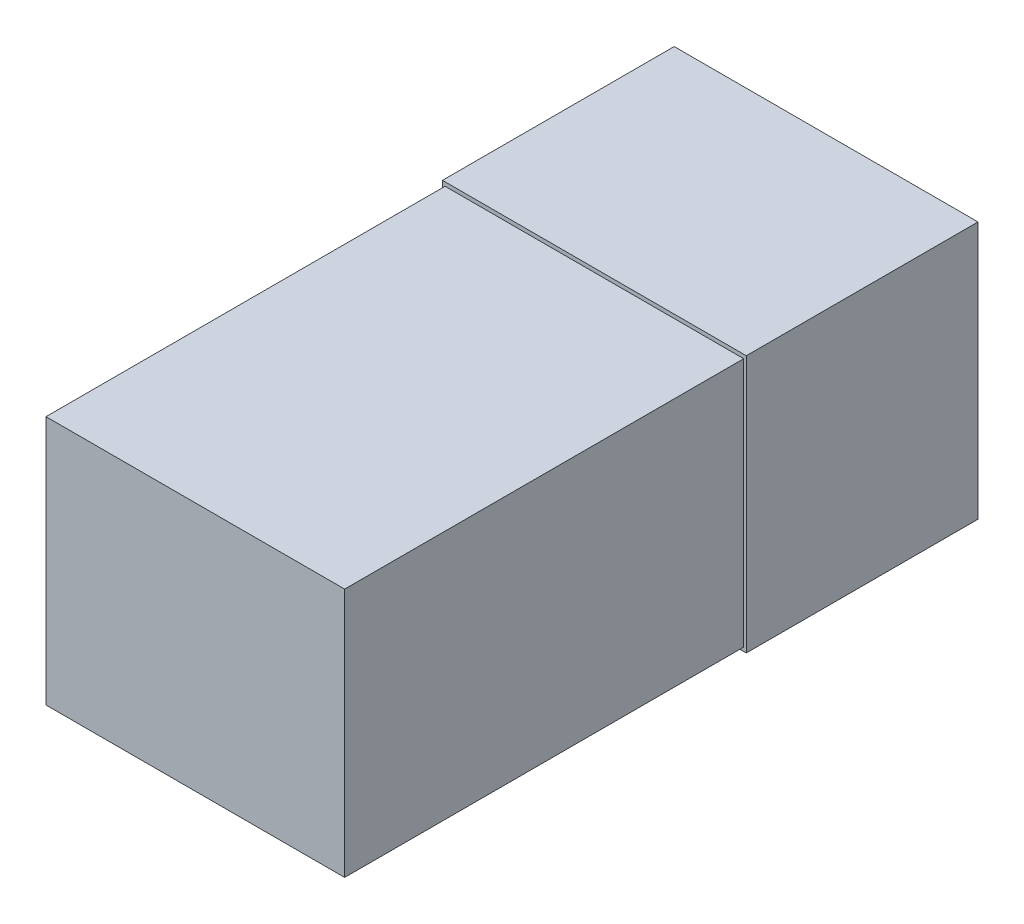
ISO-10303-21;
HEADER;
FILE_DESCRIPTION(('STEP AP214'),'2;1');
FILE_NAME('part.step','',(''),(''),'','','');
FILE_SCHEMA(('AUTOMOTIVE_DESIGN { 1 0 10303 214 1 1 1 1 }'));
ENDSEC;
DATA;
#1=APPLICATION_CONTEXT('core data for automotive mechanical design processes');
#2=APPLICATION_PROTOCOL_DEFINITION('international standard','automotive_design',2000,#1);
#3=PRODUCT_CONTEXT('',#1,'mechanical');
#4=PRODUCT('Part','Part','',(#3));
#5=PRODUCT_RELATED_PRODUCT_CATEGORY('part','',(#4));
#6=PRODUCT_DEFINITION_FORMATION('','',#4);
#7=PRODUCT_DEFINITION_CONTEXT('part definition',#1,'design');
#8=PRODUCT_DEFINITION('design','',#6,#7);
#9=PRODUCT_DEFINITION_SHAPE('','',#8);
#10=(LENGTH_UNIT() NAMED_UNIT(*) SI_UNIT(.MILLI.,.METRE.));
#11=(NAMED_UNIT(*) PLANE_ANGLE_UNIT() SI_UNIT($,.RADIAN.));
#12=(NAMED_UNIT(*) SI_UNIT($,.STERADIAN.) SOLID_ANGLE_UNIT());
#13=UNCERTAINTY_MEASURE_WITH_UNIT(LENGTH_MEASURE(1.E-05),#10,'distance_accuracy_value','');
#14=(GEOMETRIC_REPRESENTATION_CONTEXT(3) GLOBAL_UNCERTAINTY_ASSIGNED_CONTEXT((#13)) GLOBAL_UNIT_ASSIGNED_CONTEXT((#10,
#11,#12)) REPRESENTATION_CONTEXT('',''));
#15=CARTESIAN_POINT('',(0.,0.,0.));
#16=DIRECTION('',(0.,0.,1.));
#17=DIRECTION('',(1.,0.,0.));
#18=AXIS2_PLACEMENT_3D('',#15,#16,#17);
#19=CARTESIAN_POINT('',(5.8,-4.85,15.5));
#20=DIRECTION('',(-1.,0.,0.));
#21=DIRECTION('',(0.,0.,1.));
#22=AXIS2_PLACEMENT_3D('',#19,#20,#21);
#23=PLANE('',#22);
#24=DIRECTION('',(0.,1.,0.));
#25=VECTOR('',#24,1.);
#26=CARTESIAN_POINT('',(5.8,-4.85,0.));
#27=LINE('',#26,#25);
#28=CARTESIAN_POINT('',(5.8,-4.85,0.));
#29=VERTEX_POINT('',#28);
#30=CARTESIAN_POINT('',(5.8,4.85,0.));
#31=VERTEX_POINT('',#30);
#32=EDGE_CURVE('E128',#29,#31,#27,.T.);
#33=ORIENTED_EDGE('',*,*,#32,.T.);
#34=DIRECTION('',(0.,0.,-1.));
#35=VECTOR('',#34,1.);
#36=CARTESIAN_POINT('',(5.8,4.85,15.5));
#37=LINE('',#36,#35);
#38=CARTESIAN_POINT('',(5.8,4.85,15.5));
#39=VERTEX_POINT('',#38);
#40=EDGE_CURVE('E11',#39,#31,#37,.T.);
#41=ORIENTED_EDGE('',*,*,#40,.F.);
#42=DIRECTION('',(0.,1.,0.));
#43=VECTOR('',#42,1.);
#44=CARTESIAN_POINT('',(5.8,-4.85,15.5));
#45=LINE('',#44,#43);
#46=CARTESIAN_POINT('',(5.8,-4.85,15.5));
#47=VERTEX_POINT('',#46);
#48=EDGE_CURVE('E139',#47,#39,#45,.T.);
#49=ORIENTED_EDGE('',*,*,#48,.F.);
#50=DIRECTION('',(0.,0.,-1.));
#51=VECTOR('',#50,1.);
#52=CARTESIAN_POINT('',(5.8,-4.85,15.5));
#53=LINE('',#52,#51);
#54=EDGE_CURVE('E150',#47,#29,#53,.T.);
#55=ORIENTED_EDGE('',*,*,#54,.T.);
#56=EDGE_LOOP('',(#33,#41,#49,#55));
#57=FACE_BOUND('',#56,.T.);
#58=ADVANCED_FACE('F39',(#57),#23,.F.);
#59=CARTESIAN_POINT('',(-5.8,4.85,15.5));
#60=DIRECTION('',(0.,-1.,0.));
#61=DIRECTION('',(0.,0.,-1.));
#62=AXIS2_PLACEMENT_3D('',#59,#60,#61);
#63=PLANE('',#62);
#64=DIRECTION('',(-1.,0.,0.));
#65=VECTOR('',#64,1.);
#66=CARTESIAN_POINT('',(-5.8,4.85,0.));
#67=LINE('',#66,#65);
#68=CARTESIAN_POINT('',(-5.8,4.85,0.));
#69=VERTEX_POINT('',#68);
#70=EDGE_CURVE('E133',#31,#69,#67,.T.);
#71=ORIENTED_EDGE('',*,*,#70,.T.);
#72=DIRECTION('',(0.,0.,-1.));
#73=VECTOR('',#72,1.);
#74=CARTESIAN_POINT('',(-5.8,4.85,15.5));
#75=LINE('',#74,#73);
#76=CARTESIAN_POINT('',(-5.8,4.85,15.5));
#77=VERTEX_POINT('',#76);
#78=EDGE_CURVE('E48',#77,#69,#75,.T.);
#79=ORIENTED_EDGE('',*,*,#78,.F.);
#80=DIRECTION('',(-1.,0.,0.));
#81=VECTOR('',#80,1.);
#82=CARTESIAN_POINT('',(-5.8,4.85,15.5));
#83=LINE('',#82,#81);
#84=EDGE_CURVE('E142',#39,#77,#83,.T.);
#85=ORIENTED_EDGE('',*,*,#84,.F.);
#86=ORIENTED_EDGE('',*,*,#40,.T.);
#87=EDGE_LOOP('',(#71,#79,#85,#86));
#88=FACE_BOUND('',#87,.T.);
#89=ADVANCED_FACE('F177',(#88),#63,.F.);
#90=CARTESIAN_POINT('',(-5.8,-4.85,15.5));
#91=DIRECTION('',(1.,0.,0.));
#92=DIRECTION('',(0.,0.,-1.));
#93=AXIS2_PLACEMENT_3D('',#90,#91,#92);
#94=PLANE('',#93);
#95=DIRECTION('',(0.,-1.,0.));
#96=VECTOR('',#95,1.);
#97=CARTESIAN_POINT('',(-5.8,-4.85,0.));
#98=LINE('',#97,#96);
#99=CARTESIAN_POINT('',(-5.8,-4.85,0.));
#100=VERTEX_POINT('',#99);
#101=EDGE_CURVE('E155',#69,#100,#98,.T.);
#102=ORIENTED_EDGE('',*,*,#101,.T.);
#103=DIRECTION('',(0.,0.,-1.));
#104=VECTOR('',#103,1.);
#105=CARTESIAN_POINT('',(-5.8,-4.85,15.5));
#106=LINE('',#105,#104);
#107=CARTESIAN_POINT('',(-5.8,-4.85,15.5));
#108=VERTEX_POINT('',#107);
#109=EDGE_CURVE('E165',#108,#100,#106,.T.);
#110=ORIENTED_EDGE('',*,*,#109,.F.);
#111=DIRECTION('',(0.,-1.,0.));
#112=VECTOR('',#111,1.);
#113=CARTESIAN_POINT('',(-5.8,-4.85,15.5));
#114=LINE('',#113,#112);
#115=EDGE_CURVE('E146',#77,#108,#114,.T.);
#116=ORIENTED_EDGE('',*,*,#115,.F.);
#117=ORIENTED_EDGE('',*,*,#78,.T.);
#118=EDGE_LOOP('',(#102,#110,#116,#117));
#119=FACE_BOUND('',#118,.T.);
#120=ADVANCED_FACE('F173',(#119),#94,.F.);
#121=CARTESIAN_POINT('',(-5.8,-4.85,15.5));
#122=DIRECTION('',(0.,1.,0.));
#123=DIRECTION('',(0.,0.,1.));
#124=AXIS2_PLACEMENT_3D('',#121,#122,#123);
#125=PLANE('',#124);
#126=DIRECTION('',(1.,0.,0.));
#127=VECTOR('',#126,1.);
#128=CARTESIAN_POINT('',(-5.8,-4.85,0.));
#129=LINE('',#128,#127);
#130=EDGE_CURVE('E143',#100,#29,#129,.T.);
#131=ORIENTED_EDGE('',*,*,#130,.T.);
#132=ORIENTED_EDGE('',*,*,#54,.F.);
#133=DIRECTION('',(1.,0.,0.));
#134=VECTOR('',#133,1.);
#135=CARTESIAN_POINT('',(-5.8,-4.85,15.5));
#136=LINE('',#135,#134);
#137=EDGE_CURVE('E55',#108,#47,#136,.T.);
#138=ORIENTED_EDGE('',*,*,#137,.F.);
#139=ORIENTED_EDGE('',*,*,#109,.T.);
#140=EDGE_LOOP('',(#131,#132,#138,#139));
#141=FACE_BOUND('',#140,.T.);
#142=ADVANCED_FACE('F182',(#141),#125,.F.);
#143=CARTESIAN_POINT('',(0.,0.,15.5));
#144=DIRECTION('',(0.,0.,-1.));
#145=DIRECTION('',(-1.,0.,0.));
#146=AXIS2_PLACEMENT_3D('',#143,#144,#145);
#147=PLANE('',#146);
#148=ORIENTED_EDGE('',*,*,#48,.T.);
#149=ORIENTED_EDGE('',*,*,#84,.T.);
#150=ORIENTED_EDGE('',*,*,#115,.T.);
#151=ORIENTED_EDGE('',*,*,#137,.T.);
#152=EDGE_LOOP('',(#148,#149,#150,#151));
#153=FACE_BOUND('',#152,.T.);
#154=ADVANCED_FACE('F185',(#153),#147,.F.);
#155=CARTESIAN_POINT('',(0.,0.,0.));
#156=DIRECTION('',(0.,0.,1.));
#157=DIRECTION('',(1.,0.,0.));
#158=AXIS2_PLACEMENT_3D('',#155,#156,#157);
#159=PLANE('',#158);
#160=DIRECTION('',(0.,1.,0.));
#161=VECTOR('',#160,1.);
#162=CARTESIAN_POINT('',(-5.9,-5.,0.));
#163=LINE('',#162,#161);
#164=CARTESIAN_POINT('',(-5.9,-5.,0.));
#165=VERTEX_POINT('',#164);
#166=CARTESIAN_POINT('',(-5.9,5.,0.));
#167=VERTEX_POINT('',#166);
#168=EDGE_CURVE('E126',#165,#167,#163,.T.);
#169=ORIENTED_EDGE('',*,*,#168,.F.);
#170=DIRECTION('',(-1.,0.,0.));
#171=VECTOR('',#170,1.);
#172=CARTESIAN_POINT('',(5.9,-5.,0.));
#173=LINE('',#172,#171);
#174=CARTESIAN_POINT('',(5.9,-5.,0.));
#175=VERTEX_POINT('',#174);
#176=EDGE_CURVE('E122',#175,#165,#173,.T.);
#177=ORIENTED_EDGE('',*,*,#176,.F.);
#178=DIRECTION('',(0.,-1.,0.));
#179=VECTOR('',#178,1.);
#180=CARTESIAN_POINT('',(5.9,-5.,0.));
#181=LINE('',#180,#179);
#182=CARTESIAN_POINT('',(5.9,5.,0.));
#183=VERTEX_POINT('',#182);
#184=EDGE_CURVE('E270',#183,#175,#181,.T.);
#185=ORIENTED_EDGE('',*,*,#184,.F.);
#186=DIRECTION('',(1.,0.,0.));
#187=VECTOR('',#186,1.);
#188=CARTESIAN_POINT('',(5.9,5.,0.));
#189=LINE('',#188,#187);
#190=EDGE_CURVE('E274',#167,#183,#189,.T.);
#191=ORIENTED_EDGE('',*,*,#190,.F.);
#192=EDGE_LOOP('',(#169,#177,#185,#191));
#193=FACE_BOUND('',#192,.T.);
#194=ORIENTED_EDGE('',*,*,#32,.F.);
#195=ORIENTED_EDGE('',*,*,#130,.F.);
#196=ORIENTED_EDGE('',*,*,#101,.F.);
#197=ORIENTED_EDGE('',*,*,#70,.F.);
#198=EDGE_LOOP('',(#194,#195,#196,#197));
#199=FACE_BOUND('',#198,.T.);
#200=ADVANCED_FACE('F180',(#193,#199),#159,.T.);
#201=CARTESIAN_POINT('',(-5.9,-5.,-9.));
#202=DIRECTION('',(1.,0.,0.));
#203=DIRECTION('',(0.,0.,-1.));
#204=AXIS2_PLACEMENT_3D('',#201,#202,#203);
#205=PLANE('',#204);
#206=ORIENTED_EDGE('',*,*,#168,.T.);
#207=DIRECTION('',(0.,0.,1.));
#208=VECTOR('',#207,1.);
#209=CARTESIAN_POINT('',(-5.9,5.,-9.));
#210=LINE('',#209,#208);
#211=CARTESIAN_POINT('',(-5.9,5.,-9.));
#212=VERTEX_POINT('',#211);
#213=EDGE_CURVE('E104',#212,#167,#210,.T.);
#214=ORIENTED_EDGE('',*,*,#213,.F.);
#215=DIRECTION('',(0.,1.,0.));
#216=VECTOR('',#215,1.);
#217=CARTESIAN_POINT('',(-5.9,-5.,-9.));
#218=LINE('',#217,#216);
#219=CARTESIAN_POINT('',(-5.9,-5.,-9.));
#220=VERTEX_POINT('',#219);
#221=EDGE_CURVE('E112',#220,#212,#218,.T.);
#222=ORIENTED_EDGE('',*,*,#221,.F.);
#223=DIRECTION('',(0.,0.,1.));
#224=VECTOR('',#223,1.);
#225=CARTESIAN_POINT('',(-5.9,-5.,-9.));
#226=LINE('',#225,#224);
#227=EDGE_CURVE('E266',#220,#165,#226,.T.);
#228=ORIENTED_EDGE('',*,*,#227,.T.);
#229=EDGE_LOOP('',(#206,#214,#222,#228));
#230=FACE_BOUND('',#229,.T.);
#231=ADVANCED_FACE('F124',(#230),#205,.F.);
#232=CARTESIAN_POINT('',(5.9,5.,-9.));
#233=DIRECTION('',(0.,-1.,0.));
#234=DIRECTION('',(0.,0.,-1.));
#235=AXIS2_PLACEMENT_3D('',#232,#233,#234);
#236=PLANE('',#235);
#237=ORIENTED_EDGE('',*,*,#190,.T.);
#238=DIRECTION('',(0.,0.,1.));
#239=VECTOR('',#238,1.);
#240=CARTESIAN_POINT('',(5.9,5.,-9.));
#241=LINE('',#240,#239);
#242=CARTESIAN_POINT('',(5.9,5.,-9.));
#243=VERTEX_POINT('',#242);
#244=EDGE_CURVE('E107',#243,#183,#241,.T.);
#245=ORIENTED_EDGE('',*,*,#244,.F.);
#246=DIRECTION('',(1.,0.,0.));
#247=VECTOR('',#246,1.);
#248=CARTESIAN_POINT('',(5.9,5.,-9.));
#249=LINE('',#248,#247);
#250=EDGE_CURVE('E100',#212,#243,#249,.T.);
#251=ORIENTED_EDGE('',*,*,#250,.F.);
#252=ORIENTED_EDGE('',*,*,#213,.T.);
#253=EDGE_LOOP('',(#237,#245,#251,#252));
#254=FACE_BOUND('',#253,.T.);
#255=ADVANCED_FACE('F102',(#254),#236,.F.);
#256=CARTESIAN_POINT('',(5.9,-5.,-9.));
#257=DIRECTION('',(-1.,0.,0.));
#258=DIRECTION('',(0.,0.,1.));
#259=AXIS2_PLACEMENT_3D('',#256,#257,#258);
#260=PLANE('',#259);
#261=ORIENTED_EDGE('',*,*,#184,.T.);
#262=DIRECTION('',(0.,0.,1.));
#263=VECTOR('',#262,1.);
#264=CARTESIAN_POINT('',(5.9,-5.,-9.));
#265=LINE('',#264,#263);
#266=CARTESIAN_POINT('',(5.9,-5.,-9.));
#267=VERTEX_POINT('',#266);
#268=EDGE_CURVE('E135',#267,#175,#265,.T.);
#269=ORIENTED_EDGE('',*,*,#268,.F.);
#270=DIRECTION('',(0.,-1.,0.));
#271=VECTOR('',#270,1.);
#272=CARTESIAN_POINT('',(5.9,-5.,-9.));
#273=LINE('',#272,#271);
#274=EDGE_CURVE('E111',#243,#267,#273,.T.);
#275=ORIENTED_EDGE('',*,*,#274,.F.);
#276=ORIENTED_EDGE('',*,*,#244,.T.);
#277=EDGE_LOOP('',(#261,#269,#275,#276));
#278=FACE_BOUND('',#277,.T.);
#279=ADVANCED_FACE('F233',(#278),#260,.F.);
#280=CARTESIAN_POINT('',(5.9,-5.,-9.));
#281=DIRECTION('',(0.,1.,0.));
#282=DIRECTION('',(0.,0.,1.));
#283=AXIS2_PLACEMENT_3D('',#280,#281,#282);
#284=PLANE('',#283);
#285=ORIENTED_EDGE('',*,*,#176,.T.);
#286=ORIENTED_EDGE('',*,*,#227,.F.);
#287=DIRECTION('',(-1.,0.,0.));
#288=VECTOR('',#287,1.);
#289=CARTESIAN_POINT('',(5.9,-5.,-9.));
#290=LINE('',#289,#288);
#291=EDGE_CURVE('E117',#267,#220,#290,.T.);
#292=ORIENTED_EDGE('',*,*,#291,.F.);
#293=ORIENTED_EDGE('',*,*,#268,.T.);
#294=EDGE_LOOP('',(#285,#286,#292,#293));
#295=FACE_BOUND('',#294,.T.);
#296=ADVANCED_FACE('F242',(#295),#284,.F.);
#297=CARTESIAN_POINT('',(0.,0.,-9.));
#298=DIRECTION('',(0.,0.,1.));
#299=DIRECTION('',(1.,0.,0.));
#300=AXIS2_PLACEMENT_3D('',#297,#298,#299);
#301=PLANE('',#300);
#302=ORIENTED_EDGE('',*,*,#221,.T.);
#303=ORIENTED_EDGE('',*,*,#250,.T.);
#304=ORIENTED_EDGE('',*,*,#274,.T.);
#305=ORIENTED_EDGE('',*,*,#291,.T.);
#306=EDGE_LOOP('',(#302,#303,#304,#305));
#307=FACE_BOUND('',#306,.T.);
#308=ADVANCED_FACE('F115',(#307),#301,.F.);
#309=CLOSED_SHELL('',(#58,#89,#120,#142,#154,#200,#231,#255,#279,#296,#308));
#310=MANIFOLD_SOLID_BREP('B2',#309);
#311=ADVANCED_BREP_SHAPE_REPRESENTATION('',(#18,#310),#14);
#312=SHAPE_DEFINITION_REPRESENTATION(#9,#311);
ENDSEC;
END-ISO-10303-21;
